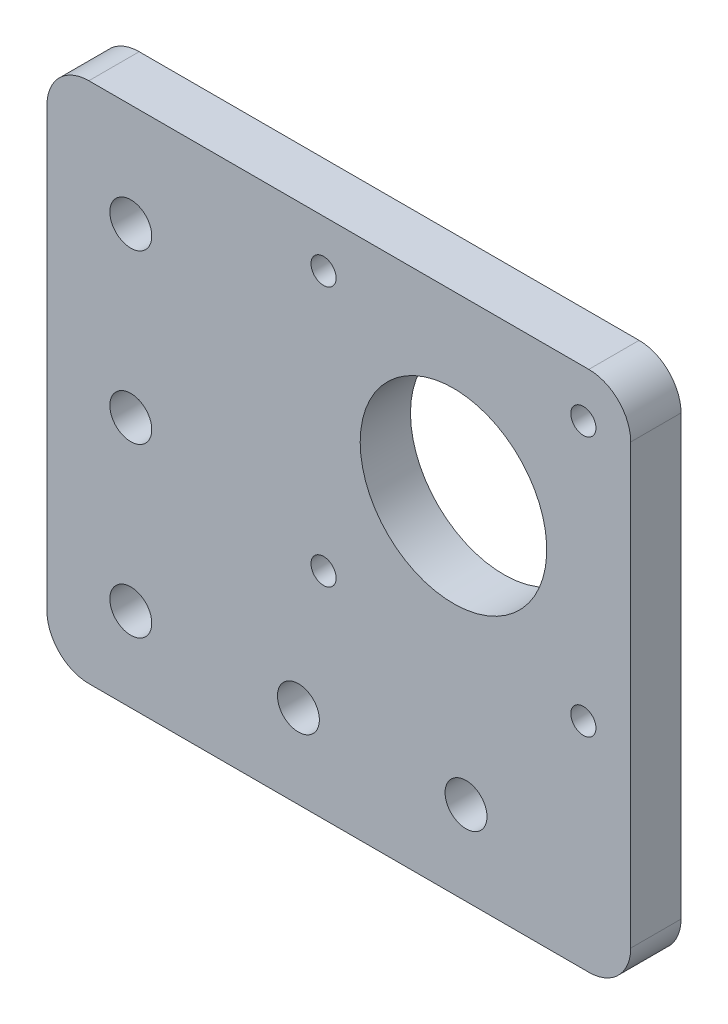
ISO-10303-21;
HEADER;
FILE_DESCRIPTION(('STEP AP214'),'2;1');
FILE_NAME('part.step','',(''),(''),'','','');
FILE_SCHEMA(('AUTOMOTIVE_DESIGN { 1 0 10303 214 1 1 1 1 }'));
ENDSEC;
DATA;
#1=APPLICATION_CONTEXT('core data for automotive mechanical design processes');
#2=APPLICATION_PROTOCOL_DEFINITION('international standard','automotive_design',2000,#1);
#3=PRODUCT_CONTEXT('',#1,'mechanical');
#4=PRODUCT('Part','Part','',(#3));
#5=PRODUCT_RELATED_PRODUCT_CATEGORY('part','',(#4));
#6=PRODUCT_DEFINITION_FORMATION('','',#4);
#7=PRODUCT_DEFINITION_CONTEXT('part definition',#1,'design');
#8=PRODUCT_DEFINITION('design','',#6,#7);
#9=PRODUCT_DEFINITION_SHAPE('','',#8);
#10=(LENGTH_UNIT() NAMED_UNIT(*) SI_UNIT(.MILLI.,.METRE.));
#11=(NAMED_UNIT(*) PLANE_ANGLE_UNIT() SI_UNIT($,.RADIAN.));
#12=(NAMED_UNIT(*) SI_UNIT($,.STERADIAN.) SOLID_ANGLE_UNIT());
#13=UNCERTAINTY_MEASURE_WITH_UNIT(LENGTH_MEASURE(1.E-05),#10,'distance_accuracy_value','');
#14=(GEOMETRIC_REPRESENTATION_CONTEXT(3) GLOBAL_UNCERTAINTY_ASSIGNED_CONTEXT((#13)) GLOBAL_UNIT_ASSIGNED_CONTEXT((#10,
#11,#12)) REPRESENTATION_CONTEXT('',''));
#15=CARTESIAN_POINT('',(0.,0.,0.));
#16=DIRECTION('',(0.,0.,1.));
#17=DIRECTION('',(1.,0.,0.));
#18=AXIS2_PLACEMENT_3D('',#15,#16,#17);
#19=CARTESIAN_POINT('',(-29.825,-26.15,0.));
#20=DIRECTION('',(0.,0.,1.));
#21=DIRECTION('',(-1.,0.,0.));
#22=AXIS2_PLACEMENT_3D('',#19,#20,#21);
#23=CYLINDRICAL_SURFACE('',#22,5.);
#24=CARTESIAN_POINT('',(-29.825,-26.15,0.));
#25=DIRECTION('',(0.,0.,1.));
#26=DIRECTION('',(-1.,0.,0.));
#27=AXIS2_PLACEMENT_3D('',#24,#25,#26);
#28=CIRCLE('',#27,5.);
#29=CARTESIAN_POINT('',(-34.825,-26.15,0.));
#30=VERTEX_POINT('',#29);
#31=CARTESIAN_POINT('',(-29.825,-31.15,0.));
#32=VERTEX_POINT('',#31);
#33=EDGE_CURVE('E141',#30,#32,#28,.T.);
#34=ORIENTED_EDGE('',*,*,#33,.T.);
#35=DIRECTION('',(0.,0.,1.));
#36=VECTOR('',#35,1.);
#37=CARTESIAN_POINT('',(-29.825,-31.15,0.));
#38=LINE('',#37,#36);
#39=CARTESIAN_POINT('',(-29.825,-31.15,6.));
#40=VERTEX_POINT('',#39);
#41=EDGE_CURVE('E11',#32,#40,#38,.T.);
#42=ORIENTED_EDGE('',*,*,#41,.T.);
#43=CARTESIAN_POINT('',(-29.825,-26.15,6.));
#44=DIRECTION('',(0.,0.,1.));
#45=DIRECTION('',(-1.,0.,0.));
#46=AXIS2_PLACEMENT_3D('',#43,#44,#45);
#47=CIRCLE('',#46,5.);
#48=CARTESIAN_POINT('',(-34.825,-26.15,6.));
#49=VERTEX_POINT('',#48);
#50=EDGE_CURVE('E187',#49,#40,#47,.T.);
#51=ORIENTED_EDGE('',*,*,#50,.F.);
#52=DIRECTION('',(0.,0.,1.));
#53=VECTOR('',#52,1.);
#54=CARTESIAN_POINT('',(-34.825,-26.15,0.));
#55=LINE('',#54,#53);
#56=EDGE_CURVE('E127',#30,#49,#55,.T.);
#57=ORIENTED_EDGE('',*,*,#56,.F.);
#58=EDGE_LOOP('',(#34,#42,#51,#57));
#59=FACE_BOUND('',#58,.T.);
#60=ADVANCED_FACE('F16',(#59),#23,.T.);
#61=CARTESIAN_POINT('',(-29.825,-31.15,0.));
#62=DIRECTION('',(0.,-1.,0.));
#63=DIRECTION('',(-1.,0.,0.));
#64=AXIS2_PLACEMENT_3D('',#61,#62,#63);
#65=PLANE('',#64);
#66=DIRECTION('',(1.,0.,0.));
#67=VECTOR('',#66,1.);
#68=CARTESIAN_POINT('',(-29.825,-31.15,0.));
#69=LINE('',#68,#67);
#70=CARTESIAN_POINT('',(29.825,-31.15,0.));
#71=VERTEX_POINT('',#70);
#72=EDGE_CURVE('E154',#32,#71,#69,.T.);
#73=ORIENTED_EDGE('',*,*,#72,.T.);
#74=DIRECTION('',(0.,0.,1.));
#75=VECTOR('',#74,1.);
#76=CARTESIAN_POINT('',(29.825,-31.15,0.));
#77=LINE('',#76,#75);
#78=CARTESIAN_POINT('',(29.825,-31.15,6.));
#79=VERTEX_POINT('',#78);
#80=EDGE_CURVE('E27',#71,#79,#77,.T.);
#81=ORIENTED_EDGE('',*,*,#80,.T.);
#82=DIRECTION('',(1.,0.,0.));
#83=VECTOR('',#82,1.);
#84=CARTESIAN_POINT('',(-29.825,-31.15,6.));
#85=LINE('',#84,#83);
#86=EDGE_CURVE('E166',#40,#79,#85,.T.);
#87=ORIENTED_EDGE('',*,*,#86,.F.);
#88=ORIENTED_EDGE('',*,*,#41,.F.);
#89=EDGE_LOOP('',(#73,#81,#87,#88));
#90=FACE_BOUND('',#89,.T.);
#91=ADVANCED_FACE('F300',(#90),#65,.T.);
#92=CARTESIAN_POINT('',(29.825,-26.15,0.));
#93=DIRECTION('',(0.,0.,1.));
#94=DIRECTION('',(0.,-1.,0.));
#95=AXIS2_PLACEMENT_3D('',#92,#93,#94);
#96=CYLINDRICAL_SURFACE('',#95,5.);
#97=CARTESIAN_POINT('',(29.825,-26.15,0.));
#98=DIRECTION('',(0.,0.,1.));
#99=DIRECTION('',(0.,-1.,0.));
#100=AXIS2_PLACEMENT_3D('',#97,#98,#99);
#101=CIRCLE('',#100,5.);
#102=CARTESIAN_POINT('',(34.825,-26.15,0.));
#103=VERTEX_POINT('',#102);
#104=EDGE_CURVE('E229',#71,#103,#101,.T.);
#105=ORIENTED_EDGE('',*,*,#104,.T.);
#106=DIRECTION('',(0.,0.,1.));
#107=VECTOR('',#106,1.);
#108=CARTESIAN_POINT('',(34.825,-26.15,0.));
#109=LINE('',#108,#107);
#110=CARTESIAN_POINT('',(34.825,-26.15,6.));
#111=VERTEX_POINT('',#110);
#112=EDGE_CURVE('E224',#103,#111,#109,.T.);
#113=ORIENTED_EDGE('',*,*,#112,.T.);
#114=CARTESIAN_POINT('',(29.825,-26.15,6.));
#115=DIRECTION('',(0.,0.,1.));
#116=DIRECTION('',(0.,-1.,0.));
#117=AXIS2_PLACEMENT_3D('',#114,#115,#116);
#118=CIRCLE('',#117,5.);
#119=EDGE_CURVE('E161',#79,#111,#118,.T.);
#120=ORIENTED_EDGE('',*,*,#119,.F.);
#121=ORIENTED_EDGE('',*,*,#80,.F.);
#122=EDGE_LOOP('',(#105,#113,#120,#121));
#123=FACE_BOUND('',#122,.T.);
#124=ADVANCED_FACE('F18',(#123),#96,.T.);
#125=CARTESIAN_POINT('',(34.825,-26.15,0.));
#126=DIRECTION('',(1.,0.,0.));
#127=DIRECTION('',(0.,1.,0.));
#128=AXIS2_PLACEMENT_3D('',#125,#126,#127);
#129=PLANE('',#128);
#130=DIRECTION('',(0.,1.,0.));
#131=VECTOR('',#130,1.);
#132=CARTESIAN_POINT('',(34.825,-26.15,0.));
#133=LINE('',#132,#131);
#134=CARTESIAN_POINT('',(34.825,26.15,0.));
#135=VERTEX_POINT('',#134);
#136=EDGE_CURVE('E225',#103,#135,#133,.T.);
#137=ORIENTED_EDGE('',*,*,#136,.T.);
#138=DIRECTION('',(0.,0.,1.));
#139=VECTOR('',#138,1.);
#140=CARTESIAN_POINT('',(34.825,26.15,0.));
#141=LINE('',#140,#139);
#142=CARTESIAN_POINT('',(34.825,26.15,6.));
#143=VERTEX_POINT('',#142);
#144=EDGE_CURVE('E212',#135,#143,#141,.T.);
#145=ORIENTED_EDGE('',*,*,#144,.T.);
#146=DIRECTION('',(0.,1.,0.));
#147=VECTOR('',#146,1.);
#148=CARTESIAN_POINT('',(34.825,-26.15,6.));
#149=LINE('',#148,#147);
#150=EDGE_CURVE('E165',#111,#143,#149,.T.);
#151=ORIENTED_EDGE('',*,*,#150,.F.);
#152=ORIENTED_EDGE('',*,*,#112,.F.);
#153=EDGE_LOOP('',(#137,#145,#151,#152));
#154=FACE_BOUND('',#153,.T.);
#155=ADVANCED_FACE('F314',(#154),#129,.T.);
#156=CARTESIAN_POINT('',(29.825,26.15,0.));
#157=DIRECTION('',(0.,0.,1.));
#158=DIRECTION('',(1.,0.,0.));
#159=AXIS2_PLACEMENT_3D('',#156,#157,#158);
#160=CYLINDRICAL_SURFACE('',#159,5.);
#161=CARTESIAN_POINT('',(29.825,26.15,0.));
#162=DIRECTION('',(0.,0.,1.));
#163=DIRECTION('',(1.,0.,0.));
#164=AXIS2_PLACEMENT_3D('',#161,#162,#163);
#165=CIRCLE('',#164,5.);
#166=CARTESIAN_POINT('',(29.825,31.15,0.));
#167=VERTEX_POINT('',#166);
#168=EDGE_CURVE('E182',#135,#167,#165,.T.);
#169=ORIENTED_EDGE('',*,*,#168,.T.);
#170=DIRECTION('',(0.,0.,1.));
#171=VECTOR('',#170,1.);
#172=CARTESIAN_POINT('',(29.825,31.15,0.));
#173=LINE('',#172,#171);
#174=CARTESIAN_POINT('',(29.825,31.15,6.));
#175=VERTEX_POINT('',#174);
#176=EDGE_CURVE('E199',#167,#175,#173,.T.);
#177=ORIENTED_EDGE('',*,*,#176,.T.);
#178=CARTESIAN_POINT('',(29.825,26.15,6.));
#179=DIRECTION('',(0.,0.,1.));
#180=DIRECTION('',(1.,0.,0.));
#181=AXIS2_PLACEMENT_3D('',#178,#179,#180);
#182=CIRCLE('',#181,5.);
#183=EDGE_CURVE('E175',#143,#175,#182,.T.);
#184=ORIENTED_EDGE('',*,*,#183,.F.);
#185=ORIENTED_EDGE('',*,*,#144,.F.);
#186=EDGE_LOOP('',(#169,#177,#184,#185));
#187=FACE_BOUND('',#186,.T.);
#188=ADVANCED_FACE('F322',(#187),#160,.T.);
#189=CARTESIAN_POINT('',(29.825,31.15,0.));
#190=DIRECTION('',(0.,1.,0.));
#191=DIRECTION('',(1.,0.,0.));
#192=AXIS2_PLACEMENT_3D('',#189,#190,#191);
#193=PLANE('',#192);
#194=DIRECTION('',(-1.,0.,0.));
#195=VECTOR('',#194,1.);
#196=CARTESIAN_POINT('',(29.825,31.15,0.));
#197=LINE('',#196,#195);
#198=CARTESIAN_POINT('',(-29.825,31.15,0.));
#199=VERTEX_POINT('',#198);
#200=EDGE_CURVE('E136',#167,#199,#197,.T.);
#201=ORIENTED_EDGE('',*,*,#200,.T.);
#202=DIRECTION('',(0.,0.,1.));
#203=VECTOR('',#202,1.);
#204=CARTESIAN_POINT('',(-29.825,31.15,0.));
#205=LINE('',#204,#203);
#206=CARTESIAN_POINT('',(-29.825,31.15,6.));
#207=VERTEX_POINT('',#206);
#208=EDGE_CURVE('E126',#199,#207,#205,.T.);
#209=ORIENTED_EDGE('',*,*,#208,.T.);
#210=DIRECTION('',(-1.,0.,0.));
#211=VECTOR('',#210,1.);
#212=CARTESIAN_POINT('',(29.825,31.15,6.));
#213=LINE('',#212,#211);
#214=EDGE_CURVE('E179',#175,#207,#213,.T.);
#215=ORIENTED_EDGE('',*,*,#214,.F.);
#216=ORIENTED_EDGE('',*,*,#176,.F.);
#217=EDGE_LOOP('',(#201,#209,#215,#216));
#218=FACE_BOUND('',#217,.T.);
#219=ADVANCED_FACE('F417',(#218),#193,.T.);
#220=CARTESIAN_POINT('',(-29.825,26.15,0.));
#221=DIRECTION('',(0.,0.,1.));
#222=DIRECTION('',(0.,1.,0.));
#223=AXIS2_PLACEMENT_3D('',#220,#221,#222);
#224=CYLINDRICAL_SURFACE('',#223,5.);
#225=CARTESIAN_POINT('',(-29.825,26.15,0.));
#226=DIRECTION('',(0.,0.,1.));
#227=DIRECTION('',(0.,1.,0.));
#228=AXIS2_PLACEMENT_3D('',#225,#226,#227);
#229=CIRCLE('',#228,5.);
#230=CARTESIAN_POINT('',(-34.825,26.15,0.));
#231=VERTEX_POINT('',#230);
#232=EDGE_CURVE('E20',#199,#231,#229,.T.);
#233=ORIENTED_EDGE('',*,*,#232,.T.);
#234=DIRECTION('',(0.,0.,1.));
#235=VECTOR('',#234,1.);
#236=CARTESIAN_POINT('',(-34.825,26.15,0.));
#237=LINE('',#236,#235);
#238=CARTESIAN_POINT('',(-34.825,26.15,6.));
#239=VERTEX_POINT('',#238);
#240=EDGE_CURVE('E114',#231,#239,#237,.T.);
#241=ORIENTED_EDGE('',*,*,#240,.T.);
#242=CARTESIAN_POINT('',(-29.825,26.15,6.));
#243=DIRECTION('',(0.,0.,1.));
#244=DIRECTION('',(0.,1.,0.));
#245=AXIS2_PLACEMENT_3D('',#242,#243,#244);
#246=CIRCLE('',#245,5.);
#247=EDGE_CURVE('E191',#207,#239,#246,.T.);
#248=ORIENTED_EDGE('',*,*,#247,.F.);
#249=ORIENTED_EDGE('',*,*,#208,.F.);
#250=EDGE_LOOP('',(#233,#241,#248,#249));
#251=FACE_BOUND('',#250,.T.);
#252=ADVANCED_FACE('F131',(#251),#224,.T.);
#253=CARTESIAN_POINT('',(-34.825,26.15,0.));
#254=DIRECTION('',(-1.,0.,0.));
#255=DIRECTION('',(0.,0.,1.));
#256=AXIS2_PLACEMENT_3D('',#253,#254,#255);
#257=PLANE('',#256);
#258=DIRECTION('',(0.,-1.,0.));
#259=VECTOR('',#258,1.);
#260=CARTESIAN_POINT('',(-34.825,26.15,0.));
#261=LINE('',#260,#259);
#262=EDGE_CURVE('E119',#231,#30,#261,.T.);
#263=ORIENTED_EDGE('',*,*,#262,.T.);
#264=ORIENTED_EDGE('',*,*,#56,.T.);
#265=DIRECTION('',(0.,-1.,0.));
#266=VECTOR('',#265,1.);
#267=CARTESIAN_POINT('',(-34.825,26.15,6.));
#268=LINE('',#267,#266);
#269=EDGE_CURVE('E121',#239,#49,#268,.T.);
#270=ORIENTED_EDGE('',*,*,#269,.F.);
#271=ORIENTED_EDGE('',*,*,#240,.F.);
#272=EDGE_LOOP('',(#263,#264,#270,#271));
#273=FACE_BOUND('',#272,.T.);
#274=ADVANCED_FACE('F116',(#273),#257,.T.);
#275=CARTESIAN_POINT('',(13.675,10.,0.));
#276=DIRECTION('',(0.,0.,1.));
#277=DIRECTION('',(-1.,0.,0.));
#278=AXIS2_PLACEMENT_3D('',#275,#276,#277);
#279=CYLINDRICAL_SURFACE('',#278,11.13);
#280=CARTESIAN_POINT('',(13.675,10.,6.));
#281=DIRECTION('',(0.,0.,-1.));
#282=DIRECTION('',(-1.,0.,0.));
#283=AXIS2_PLACEMENT_3D('',#280,#281,#282);
#284=CIRCLE('',#283,11.13);
#285=CARTESIAN_POINT('',(2.545,10.,6.));
#286=VERTEX_POINT('',#285);
#287=EDGE_CURVE('E256',#286,#286,#284,.T.);
#288=ORIENTED_EDGE('',*,*,#287,.F.);
#289=EDGE_LOOP('',(#288));
#290=FACE_BOUND('',#289,.T.);
#291=CARTESIAN_POINT('',(13.675,10.,0.));
#292=DIRECTION('',(0.,0.,1.));
#293=DIRECTION('',(-1.,0.,0.));
#294=AXIS2_PLACEMENT_3D('',#291,#292,#293);
#295=CIRCLE('',#294,11.13);
#296=CARTESIAN_POINT('',(2.545,10.,0.));
#297=VERTEX_POINT('',#296);
#298=EDGE_CURVE('E153',#297,#297,#295,.T.);
#299=ORIENTED_EDGE('',*,*,#298,.F.);
#300=EDGE_LOOP('',(#299));
#301=FACE_BOUND('',#300,.T.);
#302=ADVANCED_FACE('F426',(#290,#301),#279,.F.);
#303=CARTESIAN_POINT('',(15.175,-21.15,0.));
#304=DIRECTION('',(0.,0.,1.));
#305=DIRECTION('',(-1.,0.,0.));
#306=AXIS2_PLACEMENT_3D('',#303,#304,#305);
#307=CYLINDRICAL_SURFACE('',#306,2.5);
#308=CARTESIAN_POINT('',(15.175,-21.15,6.));
#309=DIRECTION('',(0.,0.,-1.));
#310=DIRECTION('',(-1.,0.,0.));
#311=AXIS2_PLACEMENT_3D('',#308,#309,#310);
#312=CIRCLE('',#311,2.5);
#313=CARTESIAN_POINT('',(12.675,-21.15,6.));
#314=VERTEX_POINT('',#313);
#315=EDGE_CURVE('E252',#314,#314,#312,.T.);
#316=ORIENTED_EDGE('',*,*,#315,.F.);
#317=EDGE_LOOP('',(#316));
#318=FACE_BOUND('',#317,.T.);
#319=CARTESIAN_POINT('',(15.175,-21.15,0.));
#320=DIRECTION('',(0.,0.,1.));
#321=DIRECTION('',(-1.,0.,0.));
#322=AXIS2_PLACEMENT_3D('',#319,#320,#321);
#323=CIRCLE('',#322,2.5);
#324=CARTESIAN_POINT('',(12.675,-21.15,0.));
#325=VERTEX_POINT('',#324);
#326=EDGE_CURVE('E69',#325,#325,#323,.T.);
#327=ORIENTED_EDGE('',*,*,#326,.F.);
#328=EDGE_LOOP('',(#327));
#329=FACE_BOUND('',#328,.T.);
#330=ADVANCED_FACE('F471',(#318,#329),#307,.F.);
#331=CARTESIAN_POINT('',(-4.825,-21.15,0.));
#332=DIRECTION('',(0.,0.,1.));
#333=DIRECTION('',(-1.,0.,0.));
#334=AXIS2_PLACEMENT_3D('',#331,#332,#333);
#335=CYLINDRICAL_SURFACE('',#334,2.5);
#336=CARTESIAN_POINT('',(-4.825,-21.15,6.));
#337=DIRECTION('',(0.,0.,-1.));
#338=DIRECTION('',(-1.,0.,0.));
#339=AXIS2_PLACEMENT_3D('',#336,#337,#338);
#340=CIRCLE('',#339,2.5);
#341=CARTESIAN_POINT('',(-7.325,-21.15,6.));
#342=VERTEX_POINT('',#341);
#343=EDGE_CURVE('E217',#342,#342,#340,.T.);
#344=ORIENTED_EDGE('',*,*,#343,.F.);
#345=EDGE_LOOP('',(#344));
#346=FACE_BOUND('',#345,.T.);
#347=CARTESIAN_POINT('',(-4.825,-21.15,0.));
#348=DIRECTION('',(0.,0.,1.));
#349=DIRECTION('',(-1.,0.,0.));
#350=AXIS2_PLACEMENT_3D('',#347,#348,#349);
#351=CIRCLE('',#350,2.5);
#352=CARTESIAN_POINT('',(-7.325,-21.15,0.));
#353=VERTEX_POINT('',#352);
#354=EDGE_CURVE('E55',#353,#353,#351,.T.);
#355=ORIENTED_EDGE('',*,*,#354,.F.);
#356=EDGE_LOOP('',(#355));
#357=FACE_BOUND('',#356,.T.);
#358=ADVANCED_FACE('F434',(#346,#357),#335,.F.);
#359=CARTESIAN_POINT('',(-24.825,-21.15,0.));
#360=DIRECTION('',(0.,0.,1.));
#361=DIRECTION('',(-1.,0.,0.));
#362=AXIS2_PLACEMENT_3D('',#359,#360,#361);
#363=CYLINDRICAL_SURFACE('',#362,2.5);
#364=CARTESIAN_POINT('',(-24.825,-21.15,6.));
#365=DIRECTION('',(0.,0.,-1.));
#366=DIRECTION('',(-1.,0.,0.));
#367=AXIS2_PLACEMENT_3D('',#364,#365,#366);
#368=CIRCLE('',#367,2.5);
#369=CARTESIAN_POINT('',(-27.325,-21.15,6.));
#370=VERTEX_POINT('',#369);
#371=EDGE_CURVE('E171',#370,#370,#368,.T.);
#372=ORIENTED_EDGE('',*,*,#371,.F.);
#373=EDGE_LOOP('',(#372));
#374=FACE_BOUND('',#373,.T.);
#375=CARTESIAN_POINT('',(-24.825,-21.15,0.));
#376=DIRECTION('',(0.,0.,1.));
#377=DIRECTION('',(-1.,0.,0.));
#378=AXIS2_PLACEMENT_3D('',#375,#376,#377);
#379=CIRCLE('',#378,2.5);
#380=CARTESIAN_POINT('',(-27.325,-21.15,0.));
#381=VERTEX_POINT('',#380);
#382=EDGE_CURVE('E235',#381,#381,#379,.T.);
#383=ORIENTED_EDGE('',*,*,#382,.F.);
#384=EDGE_LOOP('',(#383));
#385=FACE_BOUND('',#384,.T.);
#386=ADVANCED_FACE('F406',(#374,#385),#363,.F.);
#387=CARTESIAN_POINT('',(-24.825,-1.15,0.));
#388=DIRECTION('',(0.,0.,1.));
#389=DIRECTION('',(-1.,0.,0.));
#390=AXIS2_PLACEMENT_3D('',#387,#388,#389);
#391=CYLINDRICAL_SURFACE('',#390,2.5);
#392=CARTESIAN_POINT('',(-24.825,-1.15,6.));
#393=DIRECTION('',(0.,0.,-1.));
#394=DIRECTION('',(-1.,0.,0.));
#395=AXIS2_PLACEMENT_3D('',#392,#393,#394);
#396=CIRCLE('',#395,2.5);
#397=CARTESIAN_POINT('',(-27.325,-1.15,6.));
#398=VERTEX_POINT('',#397);
#399=EDGE_CURVE('E167',#398,#398,#396,.T.);
#400=ORIENTED_EDGE('',*,*,#399,.F.);
#401=EDGE_LOOP('',(#400));
#402=FACE_BOUND('',#401,.T.);
#403=CARTESIAN_POINT('',(-24.825,-1.15,0.));
#404=DIRECTION('',(0.,0.,1.));
#405=DIRECTION('',(-1.,0.,0.));
#406=AXIS2_PLACEMENT_3D('',#403,#404,#405);
#407=CIRCLE('',#406,2.5);
#408=CARTESIAN_POINT('',(-27.325,-1.15,0.));
#409=VERTEX_POINT('',#408);
#410=EDGE_CURVE('E206',#409,#409,#407,.T.);
#411=ORIENTED_EDGE('',*,*,#410,.F.);
#412=EDGE_LOOP('',(#411));
#413=FACE_BOUND('',#412,.T.);
#414=ADVANCED_FACE('F400',(#402,#413),#391,.F.);
#415=CARTESIAN_POINT('',(-24.825,18.85,0.));
#416=DIRECTION('',(0.,0.,1.));
#417=DIRECTION('',(-1.,0.,0.));
#418=AXIS2_PLACEMENT_3D('',#415,#416,#417);
#419=CYLINDRICAL_SURFACE('',#418,2.5);
#420=CARTESIAN_POINT('',(-24.825,18.85,6.));
#421=DIRECTION('',(0.,0.,-1.));
#422=DIRECTION('',(-1.,0.,0.));
#423=AXIS2_PLACEMENT_3D('',#420,#421,#422);
#424=CIRCLE('',#423,2.5);
#425=CARTESIAN_POINT('',(-27.325,18.85,6.));
#426=VERTEX_POINT('',#425);
#427=EDGE_CURVE('E170',#426,#426,#424,.T.);
#428=ORIENTED_EDGE('',*,*,#427,.F.);
#429=EDGE_LOOP('',(#428));
#430=FACE_BOUND('',#429,.T.);
#431=CARTESIAN_POINT('',(-24.825,18.85,0.));
#432=DIRECTION('',(0.,0.,1.));
#433=DIRECTION('',(-1.,0.,0.));
#434=AXIS2_PLACEMENT_3D('',#431,#432,#433);
#435=CIRCLE('',#434,2.5);
#436=CARTESIAN_POINT('',(-27.325,18.85,0.));
#437=VERTEX_POINT('',#436);
#438=EDGE_CURVE('E203',#437,#437,#435,.T.);
#439=ORIENTED_EDGE('',*,*,#438,.F.);
#440=EDGE_LOOP('',(#439));
#441=FACE_BOUND('',#440,.T.);
#442=ADVANCED_FACE('F405',(#430,#441),#419,.F.);
#443=CARTESIAN_POINT('',(-1.825,25.5,0.));
#444=DIRECTION('',(0.,0.,1.));
#445=DIRECTION('',(-1.,0.,0.));
#446=AXIS2_PLACEMENT_3D('',#443,#444,#445);
#447=CYLINDRICAL_SURFACE('',#446,1.5);
#448=CARTESIAN_POINT('',(-1.825,25.5,6.));
#449=DIRECTION('',(0.,0.,-1.));
#450=DIRECTION('',(-1.,0.,0.));
#451=AXIS2_PLACEMENT_3D('',#448,#449,#450);
#452=CIRCLE('',#451,1.5);
#453=CARTESIAN_POINT('',(-3.325,25.5,6.));
#454=VERTEX_POINT('',#453);
#455=EDGE_CURVE('E149',#454,#454,#452,.T.);
#456=ORIENTED_EDGE('',*,*,#455,.F.);
#457=EDGE_LOOP('',(#456));
#458=FACE_BOUND('',#457,.T.);
#459=CARTESIAN_POINT('',(-1.825,25.5,0.));
#460=DIRECTION('',(0.,0.,1.));
#461=DIRECTION('',(-1.,0.,0.));
#462=AXIS2_PLACEMENT_3D('',#459,#460,#461);
#463=CIRCLE('',#462,1.5);
#464=CARTESIAN_POINT('',(-3.325,25.5,0.));
#465=VERTEX_POINT('',#464);
#466=EDGE_CURVE('E160',#465,#465,#463,.T.);
#467=ORIENTED_EDGE('',*,*,#466,.F.);
#468=EDGE_LOOP('',(#467));
#469=FACE_BOUND('',#468,.T.);
#470=ADVANCED_FACE('F446',(#458,#469),#447,.F.);
#471=CARTESIAN_POINT('',(29.175,25.5,0.));
#472=DIRECTION('',(0.,0.,1.));
#473=DIRECTION('',(-1.,0.,0.));
#474=AXIS2_PLACEMENT_3D('',#471,#472,#473);
#475=CYLINDRICAL_SURFACE('',#474,1.5);
#476=CARTESIAN_POINT('',(29.175,25.5,6.));
#477=DIRECTION('',(0.,0.,-1.));
#478=DIRECTION('',(-1.,0.,0.));
#479=AXIS2_PLACEMENT_3D('',#476,#477,#478);
#480=CIRCLE('',#479,1.5);
#481=CARTESIAN_POINT('',(27.675,25.5,6.));
#482=VERTEX_POINT('',#481);
#483=EDGE_CURVE('E192',#482,#482,#480,.T.);
#484=ORIENTED_EDGE('',*,*,#483,.F.);
#485=EDGE_LOOP('',(#484));
#486=FACE_BOUND('',#485,.T.);
#487=CARTESIAN_POINT('',(29.175,25.5,0.));
#488=DIRECTION('',(0.,0.,1.));
#489=DIRECTION('',(-1.,0.,0.));
#490=AXIS2_PLACEMENT_3D('',#487,#488,#489);
#491=CIRCLE('',#490,1.5);
#492=CARTESIAN_POINT('',(27.675,25.5,0.));
#493=VERTEX_POINT('',#492);
#494=EDGE_CURVE('E155',#493,#493,#491,.T.);
#495=ORIENTED_EDGE('',*,*,#494,.F.);
#496=EDGE_LOOP('',(#495));
#497=FACE_BOUND('',#496,.T.);
#498=ADVANCED_FACE('F440',(#486,#497),#475,.F.);
#499=CARTESIAN_POINT('',(29.175,-5.5,0.));
#500=DIRECTION('',(0.,0.,1.));
#501=DIRECTION('',(-1.,0.,0.));
#502=AXIS2_PLACEMENT_3D('',#499,#500,#501);
#503=CYLINDRICAL_SURFACE('',#502,1.5);
#504=CARTESIAN_POINT('',(29.175,-5.5,6.));
#505=DIRECTION('',(0.,0.,-1.));
#506=DIRECTION('',(-1.,0.,0.));
#507=AXIS2_PLACEMENT_3D('',#504,#505,#506);
#508=CIRCLE('',#507,1.5);
#509=CARTESIAN_POINT('',(27.675,-5.5,6.));
#510=VERTEX_POINT('',#509);
#511=EDGE_CURVE('E196',#510,#510,#508,.T.);
#512=ORIENTED_EDGE('',*,*,#511,.F.);
#513=EDGE_LOOP('',(#512));
#514=FACE_BOUND('',#513,.T.);
#515=CARTESIAN_POINT('',(29.175,-5.5,0.));
#516=DIRECTION('',(0.,0.,1.));
#517=DIRECTION('',(-1.,0.,0.));
#518=AXIS2_PLACEMENT_3D('',#515,#516,#517);
#519=CIRCLE('',#518,1.5);
#520=CARTESIAN_POINT('',(27.675,-5.5,0.));
#521=VERTEX_POINT('',#520);
#522=EDGE_CURVE('E159',#521,#521,#519,.T.);
#523=ORIENTED_EDGE('',*,*,#522,.F.);
#524=EDGE_LOOP('',(#523));
#525=FACE_BOUND('',#524,.T.);
#526=ADVANCED_FACE('F445',(#514,#525),#503,.F.);
#527=CARTESIAN_POINT('',(-1.825,-5.5,0.));
#528=DIRECTION('',(0.,0.,1.));
#529=DIRECTION('',(-1.,0.,0.));
#530=AXIS2_PLACEMENT_3D('',#527,#528,#529);
#531=CYLINDRICAL_SURFACE('',#530,1.5);
#532=CARTESIAN_POINT('',(-1.825,-5.5,6.));
#533=DIRECTION('',(0.,0.,-1.));
#534=DIRECTION('',(-1.,0.,0.));
#535=AXIS2_PLACEMENT_3D('',#532,#533,#534);
#536=CIRCLE('',#535,1.5);
#537=CARTESIAN_POINT('',(-3.325,-5.5,6.));
#538=VERTEX_POINT('',#537);
#539=EDGE_CURVE('E39',#538,#538,#536,.T.);
#540=ORIENTED_EDGE('',*,*,#539,.F.);
#541=EDGE_LOOP('',(#540));
#542=FACE_BOUND('',#541,.T.);
#543=CARTESIAN_POINT('',(-1.825,-5.5,0.));
#544=DIRECTION('',(0.,0.,1.));
#545=DIRECTION('',(-1.,0.,0.));
#546=AXIS2_PLACEMENT_3D('',#543,#544,#545);
#547=CIRCLE('',#546,1.5);
#548=CARTESIAN_POINT('',(-3.325,-5.5,0.));
#549=VERTEX_POINT('',#548);
#550=EDGE_CURVE('E183',#549,#549,#547,.T.);
#551=ORIENTED_EDGE('',*,*,#550,.F.);
#552=EDGE_LOOP('',(#551));
#553=FACE_BOUND('',#552,.T.);
#554=ADVANCED_FACE('F456',(#542,#553),#531,.F.);
#555=CARTESIAN_POINT('',(0.,0.,6.));
#556=DIRECTION('',(0.,0.,1.));
#557=DIRECTION('',(1.,0.,0.));
#558=AXIS2_PLACEMENT_3D('',#555,#556,#557);
#559=PLANE('',#558);
#560=ORIENTED_EDGE('',*,*,#539,.T.);
#561=EDGE_LOOP('',(#560));
#562=FACE_BOUND('',#561,.T.);
#563=ORIENTED_EDGE('',*,*,#511,.T.);
#564=EDGE_LOOP('',(#563));
#565=FACE_BOUND('',#564,.T.);
#566=ORIENTED_EDGE('',*,*,#483,.T.);
#567=EDGE_LOOP('',(#566));
#568=FACE_BOUND('',#567,.T.);
#569=ORIENTED_EDGE('',*,*,#455,.T.);
#570=EDGE_LOOP('',(#569));
#571=FACE_BOUND('',#570,.T.);
#572=ORIENTED_EDGE('',*,*,#427,.T.);
#573=EDGE_LOOP('',(#572));
#574=FACE_BOUND('',#573,.T.);
#575=ORIENTED_EDGE('',*,*,#399,.T.);
#576=EDGE_LOOP('',(#575));
#577=FACE_BOUND('',#576,.T.);
#578=ORIENTED_EDGE('',*,*,#371,.T.);
#579=EDGE_LOOP('',(#578));
#580=FACE_BOUND('',#579,.T.);
#581=ORIENTED_EDGE('',*,*,#343,.T.);
#582=EDGE_LOOP('',(#581));
#583=FACE_BOUND('',#582,.T.);
#584=ORIENTED_EDGE('',*,*,#315,.T.);
#585=EDGE_LOOP('',(#584));
#586=FACE_BOUND('',#585,.T.);
#587=ORIENTED_EDGE('',*,*,#287,.T.);
#588=EDGE_LOOP('',(#587));
#589=FACE_BOUND('',#588,.T.);
#590=ORIENTED_EDGE('',*,*,#50,.T.);
#591=ORIENTED_EDGE('',*,*,#86,.T.);
#592=ORIENTED_EDGE('',*,*,#119,.T.);
#593=ORIENTED_EDGE('',*,*,#150,.T.);
#594=ORIENTED_EDGE('',*,*,#183,.T.);
#595=ORIENTED_EDGE('',*,*,#214,.T.);
#596=ORIENTED_EDGE('',*,*,#247,.T.);
#597=ORIENTED_EDGE('',*,*,#269,.T.);
#598=EDGE_LOOP('',(#590,#591,#592,#593,#594,#595,#596,#597));
#599=FACE_BOUND('',#598,.T.);
#600=ADVANCED_FACE('F294',(#562,#565,#568,#571,#574,#577,#580,#583,#586,#589,#599),#559,.T.);
#601=CARTESIAN_POINT('',(0.,0.,0.));
#602=DIRECTION('',(0.,0.,1.));
#603=DIRECTION('',(1.,0.,0.));
#604=AXIS2_PLACEMENT_3D('',#601,#602,#603);
#605=PLANE('',#604);
#606=ORIENTED_EDGE('',*,*,#550,.T.);
#607=EDGE_LOOP('',(#606));
#608=FACE_BOUND('',#607,.T.);
#609=ORIENTED_EDGE('',*,*,#522,.T.);
#610=EDGE_LOOP('',(#609));
#611=FACE_BOUND('',#610,.T.);
#612=ORIENTED_EDGE('',*,*,#494,.T.);
#613=EDGE_LOOP('',(#612));
#614=FACE_BOUND('',#613,.T.);
#615=ORIENTED_EDGE('',*,*,#466,.T.);
#616=EDGE_LOOP('',(#615));
#617=FACE_BOUND('',#616,.T.);
#618=ORIENTED_EDGE('',*,*,#438,.T.);
#619=EDGE_LOOP('',(#618));
#620=FACE_BOUND('',#619,.T.);
#621=ORIENTED_EDGE('',*,*,#410,.T.);
#622=EDGE_LOOP('',(#621));
#623=FACE_BOUND('',#622,.T.);
#624=ORIENTED_EDGE('',*,*,#382,.T.);
#625=EDGE_LOOP('',(#624));
#626=FACE_BOUND('',#625,.T.);
#627=ORIENTED_EDGE('',*,*,#354,.T.);
#628=EDGE_LOOP('',(#627));
#629=FACE_BOUND('',#628,.T.);
#630=ORIENTED_EDGE('',*,*,#326,.T.);
#631=EDGE_LOOP('',(#630));
#632=FACE_BOUND('',#631,.T.);
#633=ORIENTED_EDGE('',*,*,#298,.T.);
#634=EDGE_LOOP('',(#633));
#635=FACE_BOUND('',#634,.T.);
#636=ORIENTED_EDGE('',*,*,#262,.F.);
#637=ORIENTED_EDGE('',*,*,#232,.F.);
#638=ORIENTED_EDGE('',*,*,#200,.F.);
#639=ORIENTED_EDGE('',*,*,#168,.F.);
#640=ORIENTED_EDGE('',*,*,#136,.F.);
#641=ORIENTED_EDGE('',*,*,#104,.F.);
#642=ORIENTED_EDGE('',*,*,#72,.F.);
#643=ORIENTED_EDGE('',*,*,#33,.F.);
#644=EDGE_LOOP('',(#636,#637,#638,#639,#640,#641,#642,#643));
#645=FACE_BOUND('',#644,.T.);
#646=ADVANCED_FACE('F138',(#608,#611,#614,#617,#620,#623,#626,#629,#632,#635,#645),#605,.F.);
#647=CLOSED_SHELL('',(#60,#91,#124,#155,#188,#219,#252,#274,#302,#330,#358,#386,#414,#442,#470,
#498,#526,#554,#600,#646));
#648=MANIFOLD_SOLID_BREP('B1',#647);
#649=ADVANCED_BREP_SHAPE_REPRESENTATION('',(#18,#648),#14);
#650=SHAPE_DEFINITION_REPRESENTATION(#9,#649);
ENDSEC;
END-ISO-10303-21;
